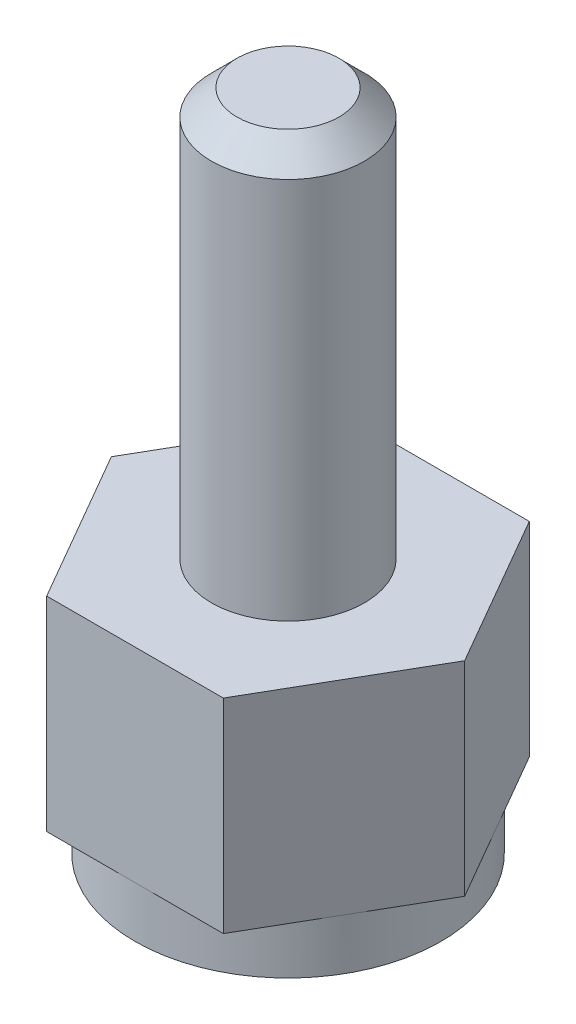
ISO-10303-21;
HEADER;
FILE_DESCRIPTION(('STEP AP214'),'2;1');
FILE_NAME('part.step','',(''),(''),'','','');
FILE_SCHEMA(('AUTOMOTIVE_DESIGN { 1 0 10303 214 1 1 1 1 }'));
ENDSEC;
DATA;
#1=APPLICATION_CONTEXT('core data for automotive mechanical design processes');
#2=APPLICATION_PROTOCOL_DEFINITION('international standard','automotive_design',2000,#1);
#3=PRODUCT_CONTEXT('',#1,'mechanical');
#4=PRODUCT('Part','Part','',(#3));
#5=PRODUCT_RELATED_PRODUCT_CATEGORY('part','',(#4));
#6=PRODUCT_DEFINITION_FORMATION('','',#4);
#7=PRODUCT_DEFINITION_CONTEXT('part definition',#1,'design');
#8=PRODUCT_DEFINITION('design','',#6,#7);
#9=PRODUCT_DEFINITION_SHAPE('','',#8);
#10=(LENGTH_UNIT() NAMED_UNIT(*) SI_UNIT(.MILLI.,.METRE.));
#11=(NAMED_UNIT(*) PLANE_ANGLE_UNIT() SI_UNIT($,.RADIAN.));
#12=(NAMED_UNIT(*) SI_UNIT($,.STERADIAN.) SOLID_ANGLE_UNIT());
#13=UNCERTAINTY_MEASURE_WITH_UNIT(LENGTH_MEASURE(1.E-05),#10,'distance_accuracy_value','');
#14=(GEOMETRIC_REPRESENTATION_CONTEXT(3) GLOBAL_UNCERTAINTY_ASSIGNED_CONTEXT((#13)) GLOBAL_UNIT_ASSIGNED_CONTEXT((#10,
#11,#12)) REPRESENTATION_CONTEXT('',''));
#15=CARTESIAN_POINT('',(0.,0.,0.));
#16=DIRECTION('',(0.,0.,1.));
#17=DIRECTION('',(1.,0.,0.));
#18=AXIS2_PLACEMENT_3D('',#15,#16,#17);
#19=CARTESIAN_POINT('',(0.,1.,0.));
#20=DIRECTION('',(0.,-1.,0.));
#21=DIRECTION('',(0.,0.,-1.));
#22=AXIS2_PLACEMENT_3D('',#19,#20,#21);
#23=CYLINDRICAL_SURFACE('',#22,3.);
#24=CARTESIAN_POINT('',(0.,1.,0.));
#25=DIRECTION('',(0.,1.,0.));
#26=DIRECTION('',(0.,0.,1.));
#27=AXIS2_PLACEMENT_3D('',#24,#25,#26);
#28=CIRCLE('',#27,3.);
#29=CARTESIAN_POINT('',(0.,1.,3.));
#30=VERTEX_POINT('',#29);
#31=CARTESIAN_POINT('',(2.59807621135332,1.,1.5));
#32=VERTEX_POINT('',#31);
#33=EDGE_CURVE('E156',#30,#32,#28,.T.);
#34=ORIENTED_EDGE('',*,*,#33,.F.);
#35=CARTESIAN_POINT('',(-2.59807621135332,1.,1.5));
#36=VERTEX_POINT('',#35);
#37=EDGE_CURVE('E62',#36,#30,#28,.T.);
#38=ORIENTED_EDGE('',*,*,#37,.F.);
#39=CARTESIAN_POINT('',(-2.59807621135332,1.,-1.5));
#40=VERTEX_POINT('',#39);
#41=EDGE_CURVE('E66',#40,#36,#28,.T.);
#42=ORIENTED_EDGE('',*,*,#41,.F.);
#43=CARTESIAN_POINT('',(0.,1.,-3.));
#44=VERTEX_POINT('',#43);
#45=EDGE_CURVE('E232',#44,#40,#28,.T.);
#46=ORIENTED_EDGE('',*,*,#45,.F.);
#47=CARTESIAN_POINT('',(2.59807621135332,1.,-1.5));
#48=VERTEX_POINT('',#47);
#49=EDGE_CURVE('E236',#48,#44,#28,.T.);
#50=ORIENTED_EDGE('',*,*,#49,.F.);
#51=EDGE_CURVE('E160',#32,#48,#28,.T.);
#52=ORIENTED_EDGE('',*,*,#51,.F.);
#53=EDGE_LOOP('',(#34,#38,#42,#46,#50,#52));
#54=FACE_BOUND('',#53,.T.);
#55=CARTESIAN_POINT('',(0.,0.,0.));
#56=DIRECTION('',(0.,1.,0.));
#57=DIRECTION('',(0.,0.,1.));
#58=AXIS2_PLACEMENT_3D('',#55,#56,#57);
#59=CIRCLE('',#58,3.);
#60=CARTESIAN_POINT('',(0.,0.,3.));
#61=VERTEX_POINT('',#60);
#62=EDGE_CURVE('E146',#61,#61,#59,.T.);
#63=ORIENTED_EDGE('',*,*,#62,.T.);
#64=EDGE_LOOP('',(#63));
#65=FACE_BOUND('',#64,.T.);
#66=ADVANCED_FACE('F45',(#54,#65),#23,.T.);
#67=CARTESIAN_POINT('',(0.,0.,0.));
#68=DIRECTION('',(0.,1.,0.));
#69=DIRECTION('',(0.,0.,1.));
#70=AXIS2_PLACEMENT_3D('',#67,#68,#69);
#71=PLANE('',#70);
#72=CARTESIAN_POINT('',(0.,0.,0.));
#73=DIRECTION('',(0.,-1.,0.));
#74=DIRECTION('',(0.,0.,-1.));
#75=AXIS2_PLACEMENT_3D('',#72,#73,#74);
#76=CIRCLE('',#75,1.5);
#77=CARTESIAN_POINT('',(0.,0.,-1.5));
#78=VERTEX_POINT('',#77);
#79=EDGE_CURVE('E171',#78,#78,#76,.T.);
#80=ORIENTED_EDGE('',*,*,#79,.F.);
#81=EDGE_LOOP('',(#80));
#82=FACE_BOUND('',#81,.T.);
#83=ORIENTED_EDGE('',*,*,#62,.F.);
#84=EDGE_LOOP('',(#83));
#85=FACE_BOUND('',#84,.T.);
#86=ADVANCED_FACE('F255',(#82,#85),#71,.F.);
#87=CARTESIAN_POINT('',(0.,1.,0.));
#88=DIRECTION('',(0.,1.,0.));
#89=DIRECTION('',(0.,0.,1.));
#90=AXIS2_PLACEMENT_3D('',#87,#88,#89);
#91=PLANE('',#90);
#92=DIRECTION('',(1.,0.,0.));
#93=VECTOR('',#92,1.);
#94=CARTESIAN_POINT('',(-1.73205080756888,1.,3.));
#95=LINE('',#94,#93);
#96=CARTESIAN_POINT('',(1.73205080756888,1.,3.));
#97=VERTEX_POINT('',#96);
#98=EDGE_CURVE('E207',#30,#97,#95,.T.);
#99=ORIENTED_EDGE('',*,*,#98,.F.);
#100=ORIENTED_EDGE('',*,*,#33,.T.);
#101=DIRECTION('',(0.5,0.,-0.866025403784439));
#102=VECTOR('',#101,1.);
#103=CARTESIAN_POINT('',(1.73205080756888,1.,3.));
#104=LINE('',#103,#102);
#105=EDGE_CURVE('E185',#97,#32,#104,.T.);
#106=ORIENTED_EDGE('',*,*,#105,.F.);
#107=EDGE_LOOP('',(#99,#100,#106));
#108=FACE_BOUND('',#107,.T.);
#109=ADVANCED_FACE('F258',(#108),#91,.F.);
#110=CARTESIAN_POINT('',(3.46410161513775,1.,0.));
#111=VERTEX_POINT('',#110);
#112=EDGE_CURVE('E143',#32,#111,#104,.T.);
#113=ORIENTED_EDGE('',*,*,#112,.F.);
#114=ORIENTED_EDGE('',*,*,#51,.T.);
#115=DIRECTION('',(-0.5,0.,-0.866025403784439));
#116=VECTOR('',#115,1.);
#117=CARTESIAN_POINT('',(3.46410161513775,1.,0.));
#118=LINE('',#117,#116);
#119=EDGE_CURVE('E189',#111,#48,#118,.T.);
#120=ORIENTED_EDGE('',*,*,#119,.F.);
#121=EDGE_LOOP('',(#113,#114,#120));
#122=FACE_BOUND('',#121,.T.);
#123=ADVANCED_FACE('F286',(#122),#91,.F.);
#124=CARTESIAN_POINT('',(1.73205080756888,1.,-3.));
#125=VERTEX_POINT('',#124);
#126=EDGE_CURVE('E188',#48,#125,#118,.T.);
#127=ORIENTED_EDGE('',*,*,#126,.F.);
#128=ORIENTED_EDGE('',*,*,#49,.T.);
#129=DIRECTION('',(-1.,0.,0.));
#130=VECTOR('',#129,1.);
#131=CARTESIAN_POINT('',(1.73205080756888,1.,-3.));
#132=LINE('',#131,#130);
#133=EDGE_CURVE('E193',#125,#44,#132,.T.);
#134=ORIENTED_EDGE('',*,*,#133,.F.);
#135=EDGE_LOOP('',(#127,#128,#134));
#136=FACE_BOUND('',#135,.T.);
#137=ADVANCED_FACE('F371',(#136),#91,.F.);
#138=CARTESIAN_POINT('',(-1.73205080756888,1.,-3.));
#139=VERTEX_POINT('',#138);
#140=EDGE_CURVE('E192',#44,#139,#132,.T.);
#141=ORIENTED_EDGE('',*,*,#140,.F.);
#142=ORIENTED_EDGE('',*,*,#45,.T.);
#143=DIRECTION('',(-0.5,0.,0.866025403784439));
#144=VECTOR('',#143,1.);
#145=CARTESIAN_POINT('',(-1.73205080756888,1.,-3.));
#146=LINE('',#145,#144);
#147=EDGE_CURVE('E198',#139,#40,#146,.T.);
#148=ORIENTED_EDGE('',*,*,#147,.F.);
#149=EDGE_LOOP('',(#141,#142,#148));
#150=FACE_BOUND('',#149,.T.);
#151=ADVANCED_FACE('F231',(#150),#91,.F.);
#152=CARTESIAN_POINT('',(-3.46410161513776,1.,0.));
#153=VERTEX_POINT('',#152);
#154=EDGE_CURVE('E197',#40,#153,#146,.T.);
#155=ORIENTED_EDGE('',*,*,#154,.F.);
#156=ORIENTED_EDGE('',*,*,#41,.T.);
#157=DIRECTION('',(0.5,0.,0.866025403784439));
#158=VECTOR('',#157,1.);
#159=CARTESIAN_POINT('',(-3.46410161513776,1.,0.));
#160=LINE('',#159,#158);
#161=EDGE_CURVE('E203',#153,#36,#160,.T.);
#162=ORIENTED_EDGE('',*,*,#161,.F.);
#163=EDGE_LOOP('',(#155,#156,#162));
#164=FACE_BOUND('',#163,.T.);
#165=ADVANCED_FACE('F239',(#164),#91,.F.);
#166=CARTESIAN_POINT('',(-1.73205080756888,1.,3.));
#167=VERTEX_POINT('',#166);
#168=EDGE_CURVE('E202',#36,#167,#160,.T.);
#169=ORIENTED_EDGE('',*,*,#168,.F.);
#170=ORIENTED_EDGE('',*,*,#37,.T.);
#171=EDGE_CURVE('E138',#167,#30,#95,.T.);
#172=ORIENTED_EDGE('',*,*,#171,.F.);
#173=EDGE_LOOP('',(#169,#170,#172));
#174=FACE_BOUND('',#173,.T.);
#175=ADVANCED_FACE('F268',(#174),#91,.F.);
#176=CARTESIAN_POINT('',(1.73205080756888,5.,3.));
#177=DIRECTION('',(-0.866025403784439,0.,-0.5));
#178=DIRECTION('',(-0.5,0.,0.866025403784439));
#179=AXIS2_PLACEMENT_3D('',#176,#177,#178);
#180=PLANE('',#179);
#181=ORIENTED_EDGE('',*,*,#105,.T.);
#182=ORIENTED_EDGE('',*,*,#112,.T.);
#183=DIRECTION('',(0.,-1.,0.));
#184=VECTOR('',#183,1.);
#185=CARTESIAN_POINT('',(3.46410161513775,5.,0.));
#186=LINE('',#185,#184);
#187=CARTESIAN_POINT('',(3.46410161513775,5.,0.));
#188=VERTEX_POINT('',#187);
#189=EDGE_CURVE('E121',#188,#111,#186,.T.);
#190=ORIENTED_EDGE('',*,*,#189,.F.);
#191=DIRECTION('',(0.5,0.,-0.866025403784439));
#192=VECTOR('',#191,1.);
#193=CARTESIAN_POINT('',(1.73205080756888,5.,3.));
#194=LINE('',#193,#192);
#195=CARTESIAN_POINT('',(1.73205080756888,5.,3.));
#196=VERTEX_POINT('',#195);
#197=EDGE_CURVE('E128',#196,#188,#194,.T.);
#198=ORIENTED_EDGE('',*,*,#197,.F.);
#199=DIRECTION('',(0.,-1.,0.));
#200=VECTOR('',#199,1.);
#201=CARTESIAN_POINT('',(1.73205080756888,5.,3.));
#202=LINE('',#201,#200);
#203=EDGE_CURVE('E184',#196,#97,#202,.T.);
#204=ORIENTED_EDGE('',*,*,#203,.T.);
#205=EDGE_LOOP('',(#181,#182,#190,#198,#204));
#206=FACE_BOUND('',#205,.T.);
#207=ADVANCED_FACE('F141',(#206),#180,.F.);
#208=CARTESIAN_POINT('',(3.46410161513775,5.,0.));
#209=DIRECTION('',(-0.866025403784439,0.,0.5));
#210=DIRECTION('',(0.5,0.,0.866025403784439));
#211=AXIS2_PLACEMENT_3D('',#208,#209,#210);
#212=PLANE('',#211);
#213=ORIENTED_EDGE('',*,*,#119,.T.);
#214=ORIENTED_EDGE('',*,*,#126,.T.);
#215=DIRECTION('',(0.,-1.,0.));
#216=VECTOR('',#215,1.);
#217=CARTESIAN_POINT('',(1.73205080756888,5.,-3.));
#218=LINE('',#217,#216);
#219=CARTESIAN_POINT('',(1.73205080756888,5.,-3.));
#220=VERTEX_POINT('',#219);
#221=EDGE_CURVE('E123',#220,#125,#218,.T.);
#222=ORIENTED_EDGE('',*,*,#221,.F.);
#223=DIRECTION('',(-0.5,0.,-0.866025403784439));
#224=VECTOR('',#223,1.);
#225=CARTESIAN_POINT('',(3.46410161513775,5.,0.));
#226=LINE('',#225,#224);
#227=EDGE_CURVE('E116',#188,#220,#226,.T.);
#228=ORIENTED_EDGE('',*,*,#227,.F.);
#229=ORIENTED_EDGE('',*,*,#189,.T.);
#230=EDGE_LOOP('',(#213,#214,#222,#228,#229));
#231=FACE_BOUND('',#230,.T.);
#232=ADVANCED_FACE('F119',(#231),#212,.F.);
#233=CARTESIAN_POINT('',(1.73205080756888,5.,-3.));
#234=DIRECTION('',(0.,0.,1.));
#235=DIRECTION('',(1.,0.,0.));
#236=AXIS2_PLACEMENT_3D('',#233,#234,#235);
#237=PLANE('',#236);
#238=ORIENTED_EDGE('',*,*,#133,.T.);
#239=ORIENTED_EDGE('',*,*,#140,.T.);
#240=DIRECTION('',(0.,-1.,0.));
#241=VECTOR('',#240,1.);
#242=CARTESIAN_POINT('',(-1.73205080756888,5.,-3.));
#243=LINE('',#242,#241);
#244=CARTESIAN_POINT('',(-1.73205080756888,5.,-3.));
#245=VERTEX_POINT('',#244);
#246=EDGE_CURVE('E152',#245,#139,#243,.T.);
#247=ORIENTED_EDGE('',*,*,#246,.F.);
#248=DIRECTION('',(-1.,0.,0.));
#249=VECTOR('',#248,1.);
#250=CARTESIAN_POINT('',(1.73205080756888,5.,-3.));
#251=LINE('',#250,#249);
#252=EDGE_CURVE('E127',#220,#245,#251,.T.);
#253=ORIENTED_EDGE('',*,*,#252,.F.);
#254=ORIENTED_EDGE('',*,*,#221,.T.);
#255=EDGE_LOOP('',(#238,#239,#247,#253,#254));
#256=FACE_BOUND('',#255,.T.);
#257=ADVANCED_FACE('F271',(#256),#237,.F.);
#258=CARTESIAN_POINT('',(-1.73205080756888,5.,-3.));
#259=DIRECTION('',(0.866025403784439,0.,0.5));
#260=DIRECTION('',(0.5,0.,-0.866025403784439));
#261=AXIS2_PLACEMENT_3D('',#258,#259,#260);
#262=PLANE('',#261);
#263=ORIENTED_EDGE('',*,*,#147,.T.);
#264=ORIENTED_EDGE('',*,*,#154,.T.);
#265=DIRECTION('',(0.,-1.,0.));
#266=VECTOR('',#265,1.);
#267=CARTESIAN_POINT('',(-3.46410161513776,5.,0.));
#268=LINE('',#267,#266);
#269=CARTESIAN_POINT('',(-3.46410161513776,5.,0.));
#270=VERTEX_POINT('',#269);
#271=EDGE_CURVE('E217',#270,#153,#268,.T.);
#272=ORIENTED_EDGE('',*,*,#271,.F.);
#273=DIRECTION('',(-0.5,0.,0.866025403784439));
#274=VECTOR('',#273,1.);
#275=CARTESIAN_POINT('',(-1.73205080756888,5.,-3.));
#276=LINE('',#275,#274);
#277=EDGE_CURVE('E176',#245,#270,#276,.T.);
#278=ORIENTED_EDGE('',*,*,#277,.F.);
#279=ORIENTED_EDGE('',*,*,#246,.T.);
#280=EDGE_LOOP('',(#263,#264,#272,#278,#279));
#281=FACE_BOUND('',#280,.T.);
#282=ADVANCED_FACE('F226',(#281),#262,.F.);
#283=CARTESIAN_POINT('',(-3.46410161513776,5.,0.));
#284=DIRECTION('',(0.866025403784439,0.,-0.5));
#285=DIRECTION('',(-0.5,0.,-0.866025403784439));
#286=AXIS2_PLACEMENT_3D('',#283,#284,#285);
#287=PLANE('',#286);
#288=ORIENTED_EDGE('',*,*,#161,.T.);
#289=ORIENTED_EDGE('',*,*,#168,.T.);
#290=DIRECTION('',(0.,-1.,0.));
#291=VECTOR('',#290,1.);
#292=CARTESIAN_POINT('',(-1.73205080756888,5.,3.));
#293=LINE('',#292,#291);
#294=CARTESIAN_POINT('',(-1.73205080756888,5.,3.));
#295=VERTEX_POINT('',#294);
#296=EDGE_CURVE('E213',#295,#167,#293,.T.);
#297=ORIENTED_EDGE('',*,*,#296,.F.);
#298=DIRECTION('',(0.5,0.,0.866025403784439));
#299=VECTOR('',#298,1.);
#300=CARTESIAN_POINT('',(-3.46410161513776,5.,0.));
#301=LINE('',#300,#299);
#302=EDGE_CURVE('E179',#270,#295,#301,.T.);
#303=ORIENTED_EDGE('',*,*,#302,.F.);
#304=ORIENTED_EDGE('',*,*,#271,.T.);
#305=EDGE_LOOP('',(#288,#289,#297,#303,#304));
#306=FACE_BOUND('',#305,.T.);
#307=ADVANCED_FACE('F276',(#306),#287,.F.);
#308=CARTESIAN_POINT('',(-1.73205080756888,5.,3.));
#309=DIRECTION('',(0.,0.,-1.));
#310=DIRECTION('',(-1.,0.,0.));
#311=AXIS2_PLACEMENT_3D('',#308,#309,#310);
#312=PLANE('',#311);
#313=ORIENTED_EDGE('',*,*,#171,.T.);
#314=ORIENTED_EDGE('',*,*,#98,.T.);
#315=ORIENTED_EDGE('',*,*,#203,.F.);
#316=DIRECTION('',(1.,0.,0.));
#317=VECTOR('',#316,1.);
#318=CARTESIAN_POINT('',(-1.73205080756888,5.,3.));
#319=LINE('',#318,#317);
#320=EDGE_CURVE('E133',#295,#196,#319,.T.);
#321=ORIENTED_EDGE('',*,*,#320,.F.);
#322=ORIENTED_EDGE('',*,*,#296,.T.);
#323=EDGE_LOOP('',(#313,#314,#315,#321,#322));
#324=FACE_BOUND('',#323,.T.);
#325=ADVANCED_FACE('F279',(#324),#312,.F.);
#326=CARTESIAN_POINT('',(0.,5.,0.));
#327=DIRECTION('',(0.,1.,0.));
#328=DIRECTION('',(0.,0.,1.));
#329=AXIS2_PLACEMENT_3D('',#326,#327,#328);
#330=PLANE('',#329);
#331=CARTESIAN_POINT('',(0.,5.,0.));
#332=DIRECTION('',(0.,1.,0.));
#333=DIRECTION('',(0.,0.,1.));
#334=AXIS2_PLACEMENT_3D('',#331,#332,#333);
#335=CIRCLE('',#334,1.5);
#336=CARTESIAN_POINT('',(0.,5.,1.5));
#337=VERTEX_POINT('',#336);
#338=EDGE_CURVE('E159',#337,#337,#335,.T.);
#339=ORIENTED_EDGE('',*,*,#338,.F.);
#340=EDGE_LOOP('',(#339));
#341=FACE_BOUND('',#340,.T.);
#342=ORIENTED_EDGE('',*,*,#197,.T.);
#343=ORIENTED_EDGE('',*,*,#227,.T.);
#344=ORIENTED_EDGE('',*,*,#252,.T.);
#345=ORIENTED_EDGE('',*,*,#277,.T.);
#346=ORIENTED_EDGE('',*,*,#302,.T.);
#347=ORIENTED_EDGE('',*,*,#320,.T.);
#348=EDGE_LOOP('',(#342,#343,#344,#345,#346,#347));
#349=FACE_BOUND('',#348,.T.);
#350=ADVANCED_FACE('F131',(#341,#349),#330,.T.);
#351=CARTESIAN_POINT('',(0.,13.,0.));
#352=DIRECTION('',(0.,-1.,0.));
#353=DIRECTION('',(0.,0.,-1.));
#354=AXIS2_PLACEMENT_3D('',#351,#352,#353);
#355=CYLINDRICAL_SURFACE('',#354,1.5);
#356=CARTESIAN_POINT('',(0.,12.5,0.));
#357=DIRECTION('',(0.,1.,0.));
#358=DIRECTION('',(0.,0.,1.));
#359=AXIS2_PLACEMENT_3D('',#356,#357,#358);
#360=CIRCLE('',#359,1.5);
#361=CARTESIAN_POINT('',(0.,12.5,1.5));
#362=VERTEX_POINT('',#361);
#363=EDGE_CURVE('E11',#362,#362,#360,.F.);
#364=ORIENTED_EDGE('',*,*,#363,.T.);
#365=EDGE_LOOP('',(#364));
#366=FACE_BOUND('',#365,.T.);
#367=ORIENTED_EDGE('',*,*,#338,.T.);
#368=EDGE_LOOP('',(#367));
#369=FACE_BOUND('',#368,.T.);
#370=ADVANCED_FACE('F290',(#366,#369),#355,.T.);
#371=CARTESIAN_POINT('',(0.,13.,0.));
#372=DIRECTION('',(0.,1.,0.));
#373=DIRECTION('',(0.,0.,1.));
#374=AXIS2_PLACEMENT_3D('',#371,#372,#373);
#375=PLANE('',#374);
#376=CARTESIAN_POINT('',(0.,13.,0.));
#377=DIRECTION('',(0.,1.,0.));
#378=DIRECTION('',(0.,0.,1.));
#379=AXIS2_PLACEMENT_3D('',#376,#377,#378);
#380=CIRCLE('',#379,0.999999999999996);
#381=CARTESIAN_POINT('',(0.,13.,0.999999999999996));
#382=VERTEX_POINT('',#381);
#383=EDGE_CURVE('E55',#382,#382,#380,.T.);
#384=ORIENTED_EDGE('',*,*,#383,.T.);
#385=EDGE_LOOP('',(#384));
#386=FACE_BOUND('',#385,.T.);
#387=ADVANCED_FACE('F294',(#386),#375,.T.);
#388=CARTESIAN_POINT('',(0.,13.,0.));
#389=DIRECTION('',(0.,-1.,0.));
#390=DIRECTION('',(0.,0.,-1.));
#391=AXIS2_PLACEMENT_3D('',#388,#389,#390);
#392=CONICAL_SURFACE('',#391,0.999999999999996,0.785398163397444);
#393=ORIENTED_EDGE('',*,*,#363,.F.);
#394=EDGE_LOOP('',(#393));
#395=FACE_BOUND('',#394,.T.);
#396=ORIENTED_EDGE('',*,*,#383,.F.);
#397=EDGE_LOOP('',(#396));
#398=FACE_BOUND('',#397,.T.);
#399=ADVANCED_FACE('F48',(#395,#398),#392,.T.);
#400=CARTESIAN_POINT('',(0.,3.,0.));
#401=DIRECTION('',(0.,-1.,0.));
#402=DIRECTION('',(0.,0.,-1.));
#403=AXIS2_PLACEMENT_3D('',#400,#401,#402);
#404=CYLINDRICAL_SURFACE('',#403,1.5);
#405=CARTESIAN_POINT('',(0.,3.,0.));
#406=DIRECTION('',(0.,-1.,0.));
#407=DIRECTION('',(0.,0.,-1.));
#408=AXIS2_PLACEMENT_3D('',#405,#406,#407);
#409=CIRCLE('',#408,1.5);
#410=CARTESIAN_POINT('',(0.,3.,-1.5));
#411=VERTEX_POINT('',#410);
#412=EDGE_CURVE('E247',#411,#411,#409,.T.);
#413=ORIENTED_EDGE('',*,*,#412,.F.);
#414=EDGE_LOOP('',(#413));
#415=FACE_BOUND('',#414,.T.);
#416=ORIENTED_EDGE('',*,*,#79,.T.);
#417=EDGE_LOOP('',(#416));
#418=FACE_BOUND('',#417,.T.);
#419=ADVANCED_FACE('F253',(#415,#418),#404,.F.);
#420=CARTESIAN_POINT('',(0.,3.,0.));
#421=DIRECTION('',(0.,-1.,0.));
#422=DIRECTION('',(0.,0.,-1.));
#423=AXIS2_PLACEMENT_3D('',#420,#421,#422);
#424=PLANE('',#423);
#425=ORIENTED_EDGE('',*,*,#412,.T.);
#426=EDGE_LOOP('',(#425));
#427=FACE_BOUND('',#426,.T.);
#428=ADVANCED_FACE('F300',(#427),#424,.T.);
#429=CLOSED_SHELL('',(#66,#86,#109,#123,#137,#151,#165,#175,#207,#232,#257,#282,#307,#325,#350,
#370,#387,#399,#419,#428));
#430=MANIFOLD_SOLID_BREP('B2',#429);
#431=ADVANCED_BREP_SHAPE_REPRESENTATION('',(#18,#430),#14);
#432=SHAPE_DEFINITION_REPRESENTATION(#9,#431);
ENDSEC;
END-ISO-10303-21;
